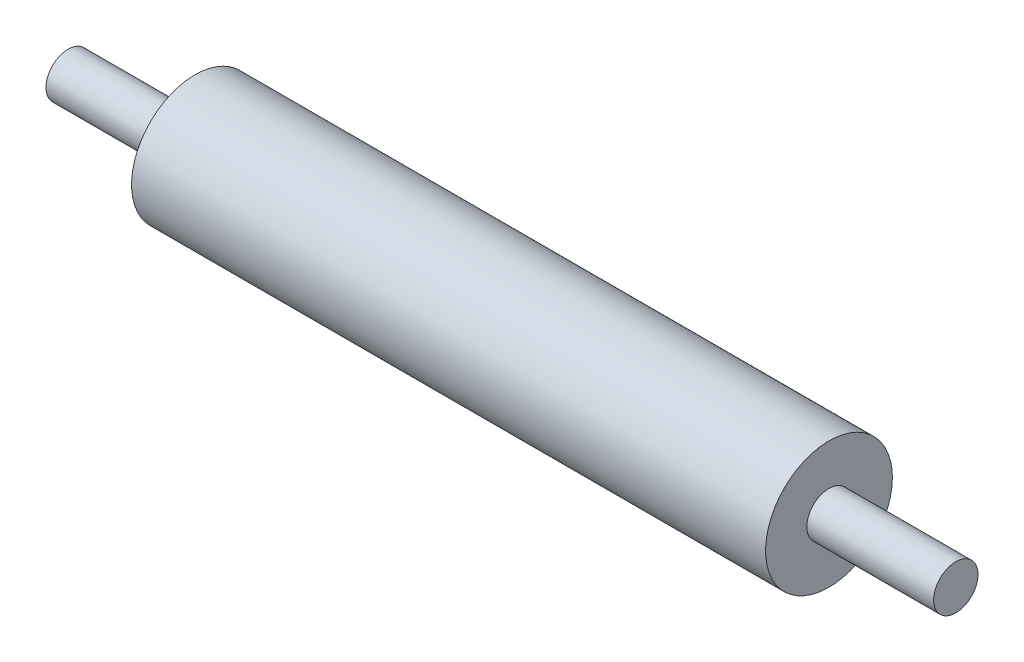
ISO-10303-21;
HEADER;
FILE_DESCRIPTION(('STEP AP214'),'2;1');
FILE_NAME('part.step','',(''),(''),'','','');
FILE_SCHEMA(('AUTOMOTIVE_DESIGN { 1 0 10303 214 1 1 1 1 }'));
ENDSEC;
DATA;
#1=APPLICATION_CONTEXT('core data for automotive mechanical design processes');
#2=APPLICATION_PROTOCOL_DEFINITION('international standard','automotive_design',2000,#1);
#3=PRODUCT_CONTEXT('',#1,'mechanical');
#4=PRODUCT('Part','Part','',(#3));
#5=PRODUCT_RELATED_PRODUCT_CATEGORY('part','',(#4));
#6=PRODUCT_DEFINITION_FORMATION('','',#4);
#7=PRODUCT_DEFINITION_CONTEXT('part definition',#1,'design');
#8=PRODUCT_DEFINITION('design','',#6,#7);
#9=PRODUCT_DEFINITION_SHAPE('','',#8);
#10=(LENGTH_UNIT() NAMED_UNIT(*) SI_UNIT(.MILLI.,.METRE.));
#11=(NAMED_UNIT(*) PLANE_ANGLE_UNIT() SI_UNIT($,.RADIAN.));
#12=(NAMED_UNIT(*) SI_UNIT($,.STERADIAN.) SOLID_ANGLE_UNIT());
#13=UNCERTAINTY_MEASURE_WITH_UNIT(LENGTH_MEASURE(1.E-05),#10,'distance_accuracy_value','');
#14=(GEOMETRIC_REPRESENTATION_CONTEXT(3) GLOBAL_UNCERTAINTY_ASSIGNED_CONTEXT((#13)) GLOBAL_UNIT_ASSIGNED_CONTEXT((#10,
#11,#12)) REPRESENTATION_CONTEXT('',''));
#15=CARTESIAN_POINT('',(0.,0.,0.));
#16=DIRECTION('',(0.,0.,1.));
#17=DIRECTION('',(1.,0.,0.));
#18=AXIS2_PLACEMENT_3D('',#15,#16,#17);
#19=CARTESIAN_POINT('',(50.,0.,0.));
#20=DIRECTION('',(-1.,0.,0.));
#21=DIRECTION('',(0.,0.,1.));
#22=AXIS2_PLACEMENT_3D('',#19,#20,#21);
#23=CYLINDRICAL_SURFACE('',#22,10.);
#24=CARTESIAN_POINT('',(50.,0.,0.));
#25=DIRECTION('',(1.,0.,0.));
#26=DIRECTION('',(0.,0.,-1.));
#27=AXIS2_PLACEMENT_3D('',#24,#25,#26);
#28=CIRCLE('',#27,10.);
#29=CARTESIAN_POINT('',(50.,0.,-10.));
#30=VERTEX_POINT('',#29);
#31=EDGE_CURVE('E42',#30,#30,#28,.T.);
#32=ORIENTED_EDGE('',*,*,#31,.F.);
#33=EDGE_LOOP('',(#32));
#34=FACE_BOUND('',#33,.T.);
#35=CARTESIAN_POINT('',(-50.,0.,0.));
#36=DIRECTION('',(1.,0.,0.));
#37=DIRECTION('',(0.,0.,-1.));
#38=AXIS2_PLACEMENT_3D('',#35,#36,#37);
#39=CIRCLE('',#38,10.);
#40=CARTESIAN_POINT('',(-50.,0.,-10.));
#41=VERTEX_POINT('',#40);
#42=EDGE_CURVE('E38',#41,#41,#39,.T.);
#43=ORIENTED_EDGE('',*,*,#42,.T.);
#44=EDGE_LOOP('',(#43));
#45=FACE_BOUND('',#44,.T.);
#46=ADVANCED_FACE('F35',(#34,#45),#23,.T.);
#47=CARTESIAN_POINT('',(50.,0.,0.));
#48=DIRECTION('',(1.,0.,0.));
#49=DIRECTION('',(0.,0.,-1.));
#50=AXIS2_PLACEMENT_3D('',#47,#48,#49);
#51=PLANE('',#50);
#52=CARTESIAN_POINT('',(50.,0.,0.));
#53=DIRECTION('',(1.,0.,0.));
#54=DIRECTION('',(0.,0.,-1.));
#55=AXIS2_PLACEMENT_3D('',#52,#53,#54);
#56=CIRCLE('',#55,3.5);
#57=CARTESIAN_POINT('',(50.,0.,-3.5));
#58=VERTEX_POINT('',#57);
#59=EDGE_CURVE('E10',#58,#58,#56,.T.);
#60=ORIENTED_EDGE('',*,*,#59,.F.);
#61=EDGE_LOOP('',(#60));
#62=FACE_BOUND('',#61,.T.);
#63=ORIENTED_EDGE('',*,*,#31,.T.);
#64=EDGE_LOOP('',(#63));
#65=FACE_BOUND('',#64,.T.);
#66=ADVANCED_FACE('F70',(#62,#65),#51,.T.);
#67=CARTESIAN_POINT('',(-50.,0.,0.));
#68=DIRECTION('',(1.,0.,0.));
#69=DIRECTION('',(0.,0.,-1.));
#70=AXIS2_PLACEMENT_3D('',#67,#68,#69);
#71=PLANE('',#70);
#72=CARTESIAN_POINT('',(-50.,0.,0.));
#73=DIRECTION('',(1.,0.,0.));
#74=DIRECTION('',(0.,0.,-1.));
#75=AXIS2_PLACEMENT_3D('',#72,#73,#74);
#76=CIRCLE('',#75,3.5);
#77=CARTESIAN_POINT('',(-50.,0.,-3.5));
#78=VERTEX_POINT('',#77);
#79=EDGE_CURVE('E52',#78,#78,#76,.T.);
#80=ORIENTED_EDGE('',*,*,#79,.T.);
#81=EDGE_LOOP('',(#80));
#82=FACE_BOUND('',#81,.T.);
#83=ORIENTED_EDGE('',*,*,#42,.F.);
#84=EDGE_LOOP('',(#83));
#85=FACE_BOUND('',#84,.T.);
#86=ADVANCED_FACE('F75',(#82,#85),#71,.F.);
#87=CARTESIAN_POINT('',(70.,0.,0.));
#88=DIRECTION('',(-1.,0.,0.));
#89=DIRECTION('',(0.,0.,1.));
#90=AXIS2_PLACEMENT_3D('',#87,#88,#89);
#91=CYLINDRICAL_SURFACE('',#90,3.5);
#92=CARTESIAN_POINT('',(70.,0.,0.));
#93=DIRECTION('',(1.,0.,0.));
#94=DIRECTION('',(0.,0.,-1.));
#95=AXIS2_PLACEMENT_3D('',#92,#93,#94);
#96=CIRCLE('',#95,3.5);
#97=CARTESIAN_POINT('',(70.,0.,-3.5));
#98=VERTEX_POINT('',#97);
#99=EDGE_CURVE('E48',#98,#98,#96,.T.);
#100=ORIENTED_EDGE('',*,*,#99,.F.);
#101=EDGE_LOOP('',(#100));
#102=FACE_BOUND('',#101,.T.);
#103=ORIENTED_EDGE('',*,*,#59,.T.);
#104=EDGE_LOOP('',(#103));
#105=FACE_BOUND('',#104,.T.);
#106=ADVANCED_FACE('F84',(#102,#105),#91,.T.);
#107=CARTESIAN_POINT('',(70.,0.,0.));
#108=DIRECTION('',(1.,0.,0.));
#109=DIRECTION('',(0.,0.,-1.));
#110=AXIS2_PLACEMENT_3D('',#107,#108,#109);
#111=PLANE('',#110);
#112=ORIENTED_EDGE('',*,*,#99,.T.);
#113=EDGE_LOOP('',(#112));
#114=FACE_BOUND('',#113,.T.);
#115=ADVANCED_FACE('F67',(#114),#111,.T.);
#116=CARTESIAN_POINT('',(-70.,0.,0.));
#117=DIRECTION('',(1.,0.,0.));
#118=DIRECTION('',(0.,0.,-1.));
#119=AXIS2_PLACEMENT_3D('',#116,#117,#118);
#120=CYLINDRICAL_SURFACE('',#119,3.5);
#121=CARTESIAN_POINT('',(-70.,0.,0.));
#122=DIRECTION('',(1.,0.,0.));
#123=DIRECTION('',(0.,0.,-1.));
#124=AXIS2_PLACEMENT_3D('',#121,#122,#123);
#125=CIRCLE('',#124,3.5);
#126=CARTESIAN_POINT('',(-70.,0.,-3.5));
#127=VERTEX_POINT('',#126);
#128=EDGE_CURVE('E51',#127,#127,#125,.T.);
#129=ORIENTED_EDGE('',*,*,#128,.T.);
#130=EDGE_LOOP('',(#129));
#131=FACE_BOUND('',#130,.T.);
#132=ORIENTED_EDGE('',*,*,#79,.F.);
#133=EDGE_LOOP('',(#132));
#134=FACE_BOUND('',#133,.T.);
#135=ADVANCED_FACE('F58',(#131,#134),#120,.T.);
#136=CARTESIAN_POINT('',(-70.,0.,0.));
#137=DIRECTION('',(-1.,0.,0.));
#138=DIRECTION('',(0.,0.,-1.));
#139=AXIS2_PLACEMENT_3D('',#136,#137,#138);
#140=PLANE('',#139);
#141=ORIENTED_EDGE('',*,*,#128,.F.);
#142=EDGE_LOOP('',(#141));
#143=FACE_BOUND('',#142,.T.);
#144=ADVANCED_FACE('F61',(#143),#140,.T.);
#145=CLOSED_SHELL('',(#46,#66,#86,#106,#115,#135,#144));
#146=MANIFOLD_SOLID_BREP('B2',#145);
#147=ADVANCED_BREP_SHAPE_REPRESENTATION('',(#18,#146),#14);
#148=SHAPE_DEFINITION_REPRESENTATION(#9,#147);
ENDSEC;
END-ISO-10303-21;
